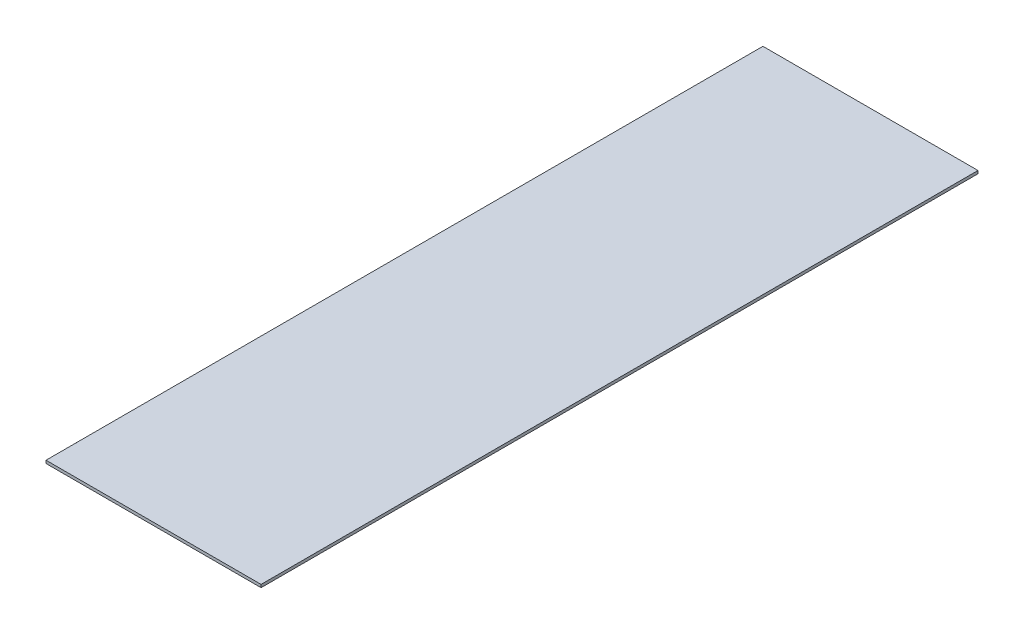
ISO-10303-21;
HEADER;
FILE_DESCRIPTION(('STEP AP214'),'2;1');
FILE_NAME('part.step','',(''),(''),'','','');
FILE_SCHEMA(('AUTOMOTIVE_DESIGN { 1 0 10303 214 1 1 1 1 }'));
ENDSEC;
DATA;
#1=APPLICATION_CONTEXT('core data for automotive mechanical design processes');
#2=APPLICATION_PROTOCOL_DEFINITION('international standard','automotive_design',2000,#1);
#3=PRODUCT_CONTEXT('',#1,'mechanical');
#4=PRODUCT('Part','Part','',(#3));
#5=PRODUCT_RELATED_PRODUCT_CATEGORY('part','',(#4));
#6=PRODUCT_DEFINITION_FORMATION('','',#4);
#7=PRODUCT_DEFINITION_CONTEXT('part definition',#1,'design');
#8=PRODUCT_DEFINITION('design','',#6,#7);
#9=PRODUCT_DEFINITION_SHAPE('','',#8);
#10=(LENGTH_UNIT() NAMED_UNIT(*) SI_UNIT(.MILLI.,.METRE.));
#11=(NAMED_UNIT(*) PLANE_ANGLE_UNIT() SI_UNIT($,.RADIAN.));
#12=(NAMED_UNIT(*) SI_UNIT($,.STERADIAN.) SOLID_ANGLE_UNIT());
#13=UNCERTAINTY_MEASURE_WITH_UNIT(LENGTH_MEASURE(1.E-05),#10,'distance_accuracy_value','');
#14=(GEOMETRIC_REPRESENTATION_CONTEXT(3) GLOBAL_UNCERTAINTY_ASSIGNED_CONTEXT((#13)) GLOBAL_UNIT_ASSIGNED_CONTEXT((#10,
#11,#12)) REPRESENTATION_CONTEXT('',''));
#15=CARTESIAN_POINT('',(0.,0.,0.));
#16=DIRECTION('',(0.,0.,1.));
#17=DIRECTION('',(1.,0.,0.));
#18=AXIS2_PLACEMENT_3D('',#15,#16,#17);
#19=CARTESIAN_POINT('',(150.,4.,500.));
#20=DIRECTION('',(-1.,0.,0.));
#21=DIRECTION('',(0.,0.,1.));
#22=AXIS2_PLACEMENT_3D('',#19,#20,#21);
#23=PLANE('',#22);
#24=DIRECTION('',(0.,0.,-1.));
#25=VECTOR('',#24,1.);
#26=CARTESIAN_POINT('',(150.,0.,500.));
#27=LINE('',#26,#25);
#28=CARTESIAN_POINT('',(150.,0.,500.));
#29=VERTEX_POINT('',#28);
#30=CARTESIAN_POINT('',(150.,0.,-500.));
#31=VERTEX_POINT('',#30);
#32=EDGE_CURVE('E98',#29,#31,#27,.T.);
#33=ORIENTED_EDGE('',*,*,#32,.T.);
#34=DIRECTION('',(0.,-1.,0.));
#35=VECTOR('',#34,1.);
#36=CARTESIAN_POINT('',(150.,4.,-500.));
#37=LINE('',#36,#35);
#38=CARTESIAN_POINT('',(150.,4.,-500.));
#39=VERTEX_POINT('',#38);
#40=EDGE_CURVE('E11',#39,#31,#37,.T.);
#41=ORIENTED_EDGE('',*,*,#40,.F.);
#42=DIRECTION('',(0.,0.,-1.));
#43=VECTOR('',#42,1.);
#44=CARTESIAN_POINT('',(150.,4.,500.));
#45=LINE('',#44,#43);
#46=CARTESIAN_POINT('',(150.,4.,500.));
#47=VERTEX_POINT('',#46);
#48=EDGE_CURVE('E86',#47,#39,#45,.T.);
#49=ORIENTED_EDGE('',*,*,#48,.F.);
#50=DIRECTION('',(0.,-1.,0.));
#51=VECTOR('',#50,1.);
#52=CARTESIAN_POINT('',(150.,4.,500.));
#53=LINE('',#52,#51);
#54=EDGE_CURVE('E94',#47,#29,#53,.T.);
#55=ORIENTED_EDGE('',*,*,#54,.T.);
#56=EDGE_LOOP('',(#33,#41,#49,#55));
#57=FACE_BOUND('',#56,.T.);
#58=ADVANCED_FACE('F35',(#57),#23,.F.);
#59=CARTESIAN_POINT('',(-150.,4.,-500.));
#60=DIRECTION('',(0.,0.,1.));
#61=DIRECTION('',(1.,0.,0.));
#62=AXIS2_PLACEMENT_3D('',#59,#60,#61);
#63=PLANE('',#62);
#64=DIRECTION('',(-1.,0.,0.));
#65=VECTOR('',#64,1.);
#66=CARTESIAN_POINT('',(-150.,0.,-500.));
#67=LINE('',#66,#65);
#68=CARTESIAN_POINT('',(-150.,0.,-500.));
#69=VERTEX_POINT('',#68);
#70=EDGE_CURVE('E90',#31,#69,#67,.T.);
#71=ORIENTED_EDGE('',*,*,#70,.T.);
#72=DIRECTION('',(0.,-1.,0.));
#73=VECTOR('',#72,1.);
#74=CARTESIAN_POINT('',(-150.,4.,-500.));
#75=LINE('',#74,#73);
#76=CARTESIAN_POINT('',(-150.,4.,-500.));
#77=VERTEX_POINT('',#76);
#78=EDGE_CURVE('E43',#77,#69,#75,.T.);
#79=ORIENTED_EDGE('',*,*,#78,.F.);
#80=DIRECTION('',(-1.,0.,0.));
#81=VECTOR('',#80,1.);
#82=CARTESIAN_POINT('',(-150.,4.,-500.));
#83=LINE('',#82,#81);
#84=EDGE_CURVE('E81',#39,#77,#83,.T.);
#85=ORIENTED_EDGE('',*,*,#84,.F.);
#86=ORIENTED_EDGE('',*,*,#40,.T.);
#87=EDGE_LOOP('',(#71,#79,#85,#86));
#88=FACE_BOUND('',#87,.T.);
#89=ADVANCED_FACE('F89',(#88),#63,.F.);
#90=CARTESIAN_POINT('',(-150.,4.,500.));
#91=DIRECTION('',(1.,0.,0.));
#92=DIRECTION('',(0.,0.,-1.));
#93=AXIS2_PLACEMENT_3D('',#90,#91,#92);
#94=PLANE('',#93);
#95=DIRECTION('',(0.,0.,1.));
#96=VECTOR('',#95,1.);
#97=CARTESIAN_POINT('',(-150.,0.,500.));
#98=LINE('',#97,#96);
#99=CARTESIAN_POINT('',(-150.,0.,500.));
#100=VERTEX_POINT('',#99);
#101=EDGE_CURVE('E68',#69,#100,#98,.T.);
#102=ORIENTED_EDGE('',*,*,#101,.T.);
#103=DIRECTION('',(0.,-1.,0.));
#104=VECTOR('',#103,1.);
#105=CARTESIAN_POINT('',(-150.,4.,500.));
#106=LINE('',#105,#104);
#107=CARTESIAN_POINT('',(-150.,4.,500.));
#108=VERTEX_POINT('',#107);
#109=EDGE_CURVE('E91',#108,#100,#106,.T.);
#110=ORIENTED_EDGE('',*,*,#109,.F.);
#111=DIRECTION('',(0.,0.,1.));
#112=VECTOR('',#111,1.);
#113=CARTESIAN_POINT('',(-150.,4.,500.));
#114=LINE('',#113,#112);
#115=EDGE_CURVE('E84',#77,#108,#114,.T.);
#116=ORIENTED_EDGE('',*,*,#115,.F.);
#117=ORIENTED_EDGE('',*,*,#78,.T.);
#118=EDGE_LOOP('',(#102,#110,#116,#117));
#119=FACE_BOUND('',#118,.T.);
#120=ADVANCED_FACE('F92',(#119),#94,.F.);
#121=CARTESIAN_POINT('',(-150.,4.,500.));
#122=DIRECTION('',(0.,0.,-1.));
#123=DIRECTION('',(-1.,0.,0.));
#124=AXIS2_PLACEMENT_3D('',#121,#122,#123);
#125=PLANE('',#124);
#126=DIRECTION('',(1.,0.,0.));
#127=VECTOR('',#126,1.);
#128=CARTESIAN_POINT('',(-150.,0.,500.));
#129=LINE('',#128,#127);
#130=EDGE_CURVE('E74',#100,#29,#129,.T.);
#131=ORIENTED_EDGE('',*,*,#130,.T.);
#132=ORIENTED_EDGE('',*,*,#54,.F.);
#133=DIRECTION('',(1.,0.,0.));
#134=VECTOR('',#133,1.);
#135=CARTESIAN_POINT('',(-150.,4.,500.));
#136=LINE('',#135,#134);
#137=EDGE_CURVE('E51',#108,#47,#136,.T.);
#138=ORIENTED_EDGE('',*,*,#137,.F.);
#139=ORIENTED_EDGE('',*,*,#109,.T.);
#140=EDGE_LOOP('',(#131,#132,#138,#139));
#141=FACE_BOUND('',#140,.T.);
#142=ADVANCED_FACE('F105',(#141),#125,.F.);
#143=CARTESIAN_POINT('',(0.,4.,0.));
#144=DIRECTION('',(0.,-1.,0.));
#145=DIRECTION('',(0.,0.,-1.));
#146=AXIS2_PLACEMENT_3D('',#143,#144,#145);
#147=PLANE('',#146);
#148=ORIENTED_EDGE('',*,*,#48,.T.);
#149=ORIENTED_EDGE('',*,*,#84,.T.);
#150=ORIENTED_EDGE('',*,*,#115,.T.);
#151=ORIENTED_EDGE('',*,*,#137,.T.);
#152=EDGE_LOOP('',(#148,#149,#150,#151));
#153=FACE_BOUND('',#152,.T.);
#154=ADVANCED_FACE('F82',(#153),#147,.F.);
#155=CARTESIAN_POINT('',(0.,0.,0.));
#156=DIRECTION('',(0.,-1.,0.));
#157=DIRECTION('',(0.,0.,-1.));
#158=AXIS2_PLACEMENT_3D('',#155,#156,#157);
#159=PLANE('',#158);
#160=ORIENTED_EDGE('',*,*,#32,.F.);
#161=ORIENTED_EDGE('',*,*,#130,.F.);
#162=ORIENTED_EDGE('',*,*,#101,.F.);
#163=ORIENTED_EDGE('',*,*,#70,.F.);
#164=EDGE_LOOP('',(#160,#161,#162,#163));
#165=FACE_BOUND('',#164,.T.);
#166=ADVANCED_FACE('F108',(#165),#159,.T.);
#167=CLOSED_SHELL('',(#58,#89,#120,#142,#154,#166));
#168=MANIFOLD_SOLID_BREP('B2',#167);
#169=ADVANCED_BREP_SHAPE_REPRESENTATION('',(#18,#168),#14);
#170=SHAPE_DEFINITION_REPRESENTATION(#9,#169);
ENDSEC;
END-ISO-10303-21;
